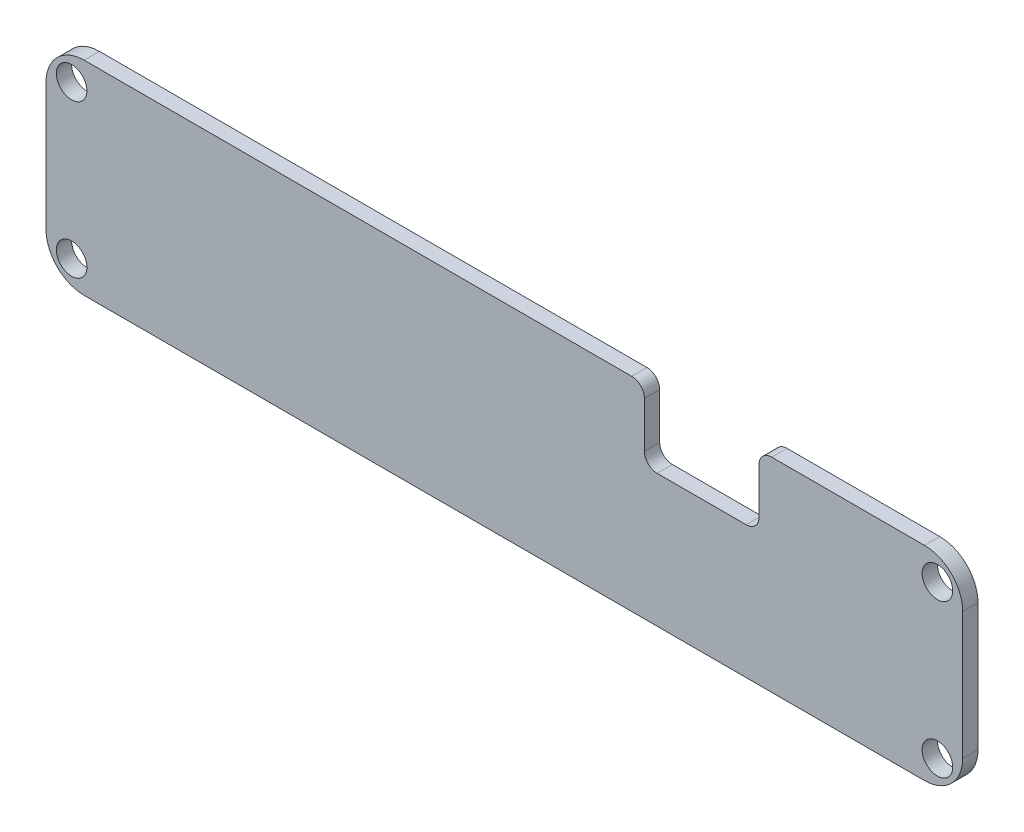
ISO-10303-21;
HEADER;
FILE_DESCRIPTION(('STEP AP214'),'2;1');
FILE_NAME('part.step','',(''),(''),'','','');
FILE_SCHEMA(('AUTOMOTIVE_DESIGN { 1 0 10303 214 1 1 1 1 }'));
ENDSEC;
DATA;
#1=APPLICATION_CONTEXT('core data for automotive mechanical design processes');
#2=APPLICATION_PROTOCOL_DEFINITION('international standard','automotive_design',2000,#1);
#3=PRODUCT_CONTEXT('',#1,'mechanical');
#4=PRODUCT('Part','Part','',(#3));
#5=PRODUCT_RELATED_PRODUCT_CATEGORY('part','',(#4));
#6=PRODUCT_DEFINITION_FORMATION('','',#4);
#7=PRODUCT_DEFINITION_CONTEXT('part definition',#1,'design');
#8=PRODUCT_DEFINITION('design','',#6,#7);
#9=PRODUCT_DEFINITION_SHAPE('','',#8);
#10=(LENGTH_UNIT() NAMED_UNIT(*) SI_UNIT(.MILLI.,.METRE.));
#11=(NAMED_UNIT(*) PLANE_ANGLE_UNIT() SI_UNIT($,.RADIAN.));
#12=(NAMED_UNIT(*) SI_UNIT($,.STERADIAN.) SOLID_ANGLE_UNIT());
#13=UNCERTAINTY_MEASURE_WITH_UNIT(LENGTH_MEASURE(1.E-05),#10,'distance_accuracy_value','');
#14=(GEOMETRIC_REPRESENTATION_CONTEXT(3) GLOBAL_UNCERTAINTY_ASSIGNED_CONTEXT((#13)) GLOBAL_UNIT_ASSIGNED_CONTEXT((#10,
#11,#12)) REPRESENTATION_CONTEXT('',''));
#15=CARTESIAN_POINT('',(0.,0.,0.));
#16=DIRECTION('',(0.,0.,1.));
#17=DIRECTION('',(1.,0.,0.));
#18=AXIS2_PLACEMENT_3D('',#15,#16,#17);
#19=CARTESIAN_POINT('',(0.,16.,1.2));
#20=DIRECTION('',(0.,-1.,0.));
#21=DIRECTION('',(0.,0.,-1.));
#22=AXIS2_PLACEMENT_3D('',#19,#20,#21);
#23=PLANE('',#22);
#24=DIRECTION('',(-1.,0.,0.));
#25=VECTOR('',#24,1.);
#26=CARTESIAN_POINT('',(0.,16.,0.));
#27=LINE('',#26,#25);
#28=CARTESIAN_POINT('',(69.,16.,0.));
#29=VERTEX_POINT('',#28);
#30=CARTESIAN_POINT('',(57.,16.,0.));
#31=VERTEX_POINT('',#30);
#32=EDGE_CURVE('E192',#29,#31,#27,.T.);
#33=ORIENTED_EDGE('',*,*,#32,.T.);
#34=DIRECTION('',(0.,0.,-1.));
#35=VECTOR('',#34,1.);
#36=CARTESIAN_POINT('',(57.,16.,1.2));
#37=LINE('',#36,#35);
#38=CARTESIAN_POINT('',(57.,16.,1.2));
#39=VERTEX_POINT('',#38);
#40=EDGE_CURVE('E247',#31,#39,#37,.F.);
#41=ORIENTED_EDGE('',*,*,#40,.T.);
#42=DIRECTION('',(-1.,0.,0.));
#43=VECTOR('',#42,1.);
#44=CARTESIAN_POINT('',(0.,16.,1.2));
#45=LINE('',#44,#43);
#46=CARTESIAN_POINT('',(69.,16.,1.2));
#47=VERTEX_POINT('',#46);
#48=EDGE_CURVE('E195',#47,#39,#45,.T.);
#49=ORIENTED_EDGE('',*,*,#48,.F.);
#50=DIRECTION('',(0.,0.,-1.));
#51=VECTOR('',#50,1.);
#52=CARTESIAN_POINT('',(69.,16.,1.2));
#53=LINE('',#52,#51);
#54=EDGE_CURVE('E212',#47,#29,#53,.T.);
#55=ORIENTED_EDGE('',*,*,#54,.T.);
#56=EDGE_LOOP('',(#33,#41,#49,#55));
#57=FACE_BOUND('',#56,.T.);
#58=ADVANCED_FACE('F41',(#57),#23,.F.);
#59=CARTESIAN_POINT('',(0.,0.,1.2));
#60=DIRECTION('',(1.,0.,0.));
#61=DIRECTION('',(0.,0.,-1.));
#62=AXIS2_PLACEMENT_3D('',#59,#60,#61);
#63=PLANE('',#62);
#64=DIRECTION('',(0.,-1.,0.));
#65=VECTOR('',#64,1.);
#66=CARTESIAN_POINT('',(0.,0.,0.));
#67=LINE('',#66,#65);
#68=CARTESIAN_POINT('',(0.,13.,0.));
#69=VERTEX_POINT('',#68);
#70=CARTESIAN_POINT('',(0.,3.,0.));
#71=VERTEX_POINT('',#70);
#72=EDGE_CURVE('E183',#69,#71,#67,.T.);
#73=ORIENTED_EDGE('',*,*,#72,.T.);
#74=DIRECTION('',(0.,0.,-1.));
#75=VECTOR('',#74,1.);
#76=CARTESIAN_POINT('',(0.,3.,1.2));
#77=LINE('',#76,#75);
#78=CARTESIAN_POINT('',(0.,3.,1.2));
#79=VERTEX_POINT('',#78);
#80=EDGE_CURVE('E160',#71,#79,#77,.F.);
#81=ORIENTED_EDGE('',*,*,#80,.T.);
#82=DIRECTION('',(0.,-1.,0.));
#83=VECTOR('',#82,1.);
#84=CARTESIAN_POINT('',(0.,0.,1.2));
#85=LINE('',#84,#83);
#86=CARTESIAN_POINT('',(0.,13.,1.2));
#87=VERTEX_POINT('',#86);
#88=EDGE_CURVE('E194',#87,#79,#85,.T.);
#89=ORIENTED_EDGE('',*,*,#88,.F.);
#90=DIRECTION('',(0.,0.,-1.));
#91=VECTOR('',#90,1.);
#92=CARTESIAN_POINT('',(0.,13.,1.2));
#93=LINE('',#92,#91);
#94=EDGE_CURVE('E164',#87,#69,#93,.T.);
#95=ORIENTED_EDGE('',*,*,#94,.T.);
#96=EDGE_LOOP('',(#73,#81,#89,#95));
#97=FACE_BOUND('',#96,.T.);
#98=ADVANCED_FACE('F326',(#97),#63,.F.);
#99=CARTESIAN_POINT('',(0.,0.,1.2));
#100=DIRECTION('',(0.,1.,0.));
#101=DIRECTION('',(0.,0.,1.));
#102=AXIS2_PLACEMENT_3D('',#99,#100,#101);
#103=PLANE('',#102);
#104=DIRECTION('',(1.,0.,0.));
#105=VECTOR('',#104,1.);
#106=CARTESIAN_POINT('',(0.,0.,1.2));
#107=LINE('',#106,#105);
#108=CARTESIAN_POINT('',(3.,0.,1.2));
#109=VERTEX_POINT('',#108);
#110=CARTESIAN_POINT('',(69.,0.,1.2));
#111=VERTEX_POINT('',#110);
#112=EDGE_CURVE('E174',#109,#111,#107,.T.);
#113=ORIENTED_EDGE('',*,*,#112,.F.);
#114=DIRECTION('',(0.,0.,-1.));
#115=VECTOR('',#114,1.);
#116=CARTESIAN_POINT('',(3.,0.,1.2));
#117=LINE('',#116,#115);
#118=CARTESIAN_POINT('',(3.,0.,0.));
#119=VERTEX_POINT('',#118);
#120=EDGE_CURVE('E159',#109,#119,#117,.T.);
#121=ORIENTED_EDGE('',*,*,#120,.T.);
#122=DIRECTION('',(1.,0.,0.));
#123=VECTOR('',#122,1.);
#124=CARTESIAN_POINT('',(0.,0.,0.));
#125=LINE('',#124,#123);
#126=CARTESIAN_POINT('',(69.,0.,0.));
#127=VERTEX_POINT('',#126);
#128=EDGE_CURVE('E171',#119,#127,#125,.T.);
#129=ORIENTED_EDGE('',*,*,#128,.T.);
#130=DIRECTION('',(0.,0.,-1.));
#131=VECTOR('',#130,1.);
#132=CARTESIAN_POINT('',(69.,0.,1.2));
#133=LINE('',#132,#131);
#134=EDGE_CURVE('E176',#127,#111,#133,.F.);
#135=ORIENTED_EDGE('',*,*,#134,.T.);
#136=EDGE_LOOP('',(#113,#121,#129,#135));
#137=FACE_BOUND('',#136,.T.);
#138=ADVANCED_FACE('F170',(#137),#103,.F.);
#139=CARTESIAN_POINT('',(72.,0.,1.2));
#140=DIRECTION('',(-1.,0.,0.));
#141=DIRECTION('',(0.,0.,1.));
#142=AXIS2_PLACEMENT_3D('',#139,#140,#141);
#143=PLANE('',#142);
#144=DIRECTION('',(0.,1.,0.));
#145=VECTOR('',#144,1.);
#146=CARTESIAN_POINT('',(72.,0.,1.2));
#147=LINE('',#146,#145);
#148=CARTESIAN_POINT('',(72.,3.,1.2));
#149=VERTEX_POINT('',#148);
#150=CARTESIAN_POINT('',(72.,13.,1.2));
#151=VERTEX_POINT('',#150);
#152=EDGE_CURVE('E312',#149,#151,#147,.T.);
#153=ORIENTED_EDGE('',*,*,#152,.F.);
#154=DIRECTION('',(0.,0.,-1.));
#155=VECTOR('',#154,1.);
#156=CARTESIAN_POINT('',(72.,3.,1.2));
#157=LINE('',#156,#155);
#158=CARTESIAN_POINT('',(72.,3.,0.));
#159=VERTEX_POINT('',#158);
#160=EDGE_CURVE('E220',#149,#159,#157,.T.);
#161=ORIENTED_EDGE('',*,*,#160,.T.);
#162=DIRECTION('',(0.,1.,0.));
#163=VECTOR('',#162,1.);
#164=CARTESIAN_POINT('',(72.,0.,0.));
#165=LINE('',#164,#163);
#166=CARTESIAN_POINT('',(72.,13.,0.));
#167=VERTEX_POINT('',#166);
#168=EDGE_CURVE('E182',#159,#167,#165,.T.);
#169=ORIENTED_EDGE('',*,*,#168,.T.);
#170=DIRECTION('',(0.,0.,-1.));
#171=VECTOR('',#170,1.);
#172=CARTESIAN_POINT('',(72.,13.,1.2));
#173=LINE('',#172,#171);
#174=EDGE_CURVE('E218',#167,#151,#173,.F.);
#175=ORIENTED_EDGE('',*,*,#174,.T.);
#176=EDGE_LOOP('',(#153,#161,#169,#175));
#177=FACE_BOUND('',#176,.T.);
#178=ADVANCED_FACE('F361',(#177),#143,.F.);
#179=CARTESIAN_POINT('',(46.,16.,1.2));
#180=VERTEX_POINT('',#179);
#181=CARTESIAN_POINT('',(3.,16.,1.2));
#182=VERTEX_POINT('',#181);
#183=EDGE_CURVE('E314',#180,#182,#45,.T.);
#184=ORIENTED_EDGE('',*,*,#183,.F.);
#185=DIRECTION('',(0.,0.,1.));
#186=VECTOR('',#185,1.);
#187=CARTESIAN_POINT('',(46.,16.,1.2));
#188=LINE('',#187,#186);
#189=CARTESIAN_POINT('',(46.,16.,0.));
#190=VERTEX_POINT('',#189);
#191=EDGE_CURVE('E64',#180,#190,#188,.F.);
#192=ORIENTED_EDGE('',*,*,#191,.T.);
#193=CARTESIAN_POINT('',(3.,16.,0.));
#194=VERTEX_POINT('',#193);
#195=EDGE_CURVE('E186',#190,#194,#27,.T.);
#196=ORIENTED_EDGE('',*,*,#195,.T.);
#197=DIRECTION('',(0.,0.,-1.));
#198=VECTOR('',#197,1.);
#199=CARTESIAN_POINT('',(3.,16.,1.2));
#200=LINE('',#199,#198);
#201=EDGE_CURVE('E215',#194,#182,#200,.F.);
#202=ORIENTED_EDGE('',*,*,#201,.T.);
#203=EDGE_LOOP('',(#184,#192,#196,#202));
#204=FACE_BOUND('',#203,.T.);
#205=ADVANCED_FACE('F321',(#204),#23,.F.);
#206=CARTESIAN_POINT('',(0.,0.,1.2));
#207=DIRECTION('',(0.,0.,-1.));
#208=DIRECTION('',(-1.,0.,0.));
#209=AXIS2_PLACEMENT_3D('',#206,#207,#208);
#210=PLANE('',#209);
#211=DIRECTION('',(0.,-1.,0.));
#212=VECTOR('',#211,1.);
#213=CARTESIAN_POINT('',(47.,16.4000000000001,1.2));
#214=LINE('',#213,#212);
#215=CARTESIAN_POINT('',(47.,15.,1.2));
#216=VERTEX_POINT('',#215);
#217=CARTESIAN_POINT('',(47.,11.4000000000001,1.2));
#218=VERTEX_POINT('',#217);
#219=EDGE_CURVE('E335',#216,#218,#214,.T.);
#220=ORIENTED_EDGE('',*,*,#219,.F.);
#221=CARTESIAN_POINT('',(46.,15.,1.2));
#222=DIRECTION('',(0.,0.,-1.));
#223=DIRECTION('',(-1.,0.,0.));
#224=AXIS2_PLACEMENT_3D('',#221,#222,#223);
#225=CIRCLE('',#224,1.);
#226=EDGE_CURVE('E241',#216,#180,#225,.F.);
#227=ORIENTED_EDGE('',*,*,#226,.T.);
#228=ORIENTED_EDGE('',*,*,#183,.T.);
#229=CARTESIAN_POINT('',(3.,13.,1.2));
#230=DIRECTION('',(0.,0.,-1.));
#231=DIRECTION('',(-1.,0.,0.));
#232=AXIS2_PLACEMENT_3D('',#229,#230,#231);
#233=CIRCLE('',#232,3.);
#234=EDGE_CURVE('E208',#182,#87,#233,.F.);
#235=ORIENTED_EDGE('',*,*,#234,.T.);
#236=ORIENTED_EDGE('',*,*,#88,.T.);
#237=CARTESIAN_POINT('',(3.,3.,1.2));
#238=DIRECTION('',(0.,0.,-1.));
#239=DIRECTION('',(-1.,0.,0.));
#240=AXIS2_PLACEMENT_3D('',#237,#238,#239);
#241=CIRCLE('',#240,3.);
#242=EDGE_CURVE('E210',#79,#109,#241,.F.);
#243=ORIENTED_EDGE('',*,*,#242,.T.);
#244=ORIENTED_EDGE('',*,*,#112,.T.);
#245=CARTESIAN_POINT('',(69.,3.,1.2));
#246=DIRECTION('',(0.,0.,-1.));
#247=DIRECTION('',(-1.,0.,0.));
#248=AXIS2_PLACEMENT_3D('',#245,#246,#247);
#249=CIRCLE('',#248,3.);
#250=EDGE_CURVE('E206',#111,#149,#249,.F.);
#251=ORIENTED_EDGE('',*,*,#250,.T.);
#252=ORIENTED_EDGE('',*,*,#152,.T.);
#253=CARTESIAN_POINT('',(69.,13.,1.2));
#254=DIRECTION('',(0.,0.,-1.));
#255=DIRECTION('',(-1.,0.,0.));
#256=AXIS2_PLACEMENT_3D('',#253,#254,#255);
#257=CIRCLE('',#256,3.);
#258=EDGE_CURVE('E204',#151,#47,#257,.F.);
#259=ORIENTED_EDGE('',*,*,#258,.T.);
#260=ORIENTED_EDGE('',*,*,#48,.T.);
#261=CARTESIAN_POINT('',(57.,15.,1.2));
#262=DIRECTION('',(0.,0.,-1.));
#263=DIRECTION('',(-1.,0.,0.));
#264=AXIS2_PLACEMENT_3D('',#261,#262,#263);
#265=CIRCLE('',#264,1.);
#266=CARTESIAN_POINT('',(56.,15.,1.2));
#267=VERTEX_POINT('',#266);
#268=EDGE_CURVE('E239',#39,#267,#265,.F.);
#269=ORIENTED_EDGE('',*,*,#268,.T.);
#270=DIRECTION('',(0.,1.,0.));
#271=VECTOR('',#270,1.);
#272=CARTESIAN_POINT('',(56.,16.4000000000001,1.2));
#273=LINE('',#272,#271);
#274=CARTESIAN_POINT('',(56.,11.4000000000001,1.2));
#275=VERTEX_POINT('',#274);
#276=EDGE_CURVE('E265',#275,#267,#273,.T.);
#277=ORIENTED_EDGE('',*,*,#276,.F.);
#278=CARTESIAN_POINT('',(55.,11.4000000000001,1.2));
#279=DIRECTION('',(0.,0.,-1.));
#280=DIRECTION('',(-1.,0.,0.));
#281=AXIS2_PLACEMENT_3D('',#278,#279,#280);
#282=CIRCLE('',#281,1.);
#283=CARTESIAN_POINT('',(55.,10.4000000000001,1.2));
#284=VERTEX_POINT('',#283);
#285=EDGE_CURVE('E11',#275,#284,#282,.T.);
#286=ORIENTED_EDGE('',*,*,#285,.T.);
#287=DIRECTION('',(1.,0.,0.));
#288=VECTOR('',#287,1.);
#289=CARTESIAN_POINT('',(56.,10.4000000000001,1.2));
#290=LINE('',#289,#288);
#291=CARTESIAN_POINT('',(48.,10.4000000000001,1.2));
#292=VERTEX_POINT('',#291);
#293=EDGE_CURVE('E275',#292,#284,#290,.T.);
#294=ORIENTED_EDGE('',*,*,#293,.F.);
#295=CARTESIAN_POINT('',(48.,11.4000000000001,1.2));
#296=DIRECTION('',(0.,0.,-1.));
#297=DIRECTION('',(-1.,0.,0.));
#298=AXIS2_PLACEMENT_3D('',#295,#296,#297);
#299=CIRCLE('',#298,1.);
#300=EDGE_CURVE('E251',#292,#218,#299,.T.);
#301=ORIENTED_EDGE('',*,*,#300,.T.);
#302=EDGE_LOOP('',(#220,#227,#228,#235,#236,#243,#244,#251,#252,#259,#260,#269,#277,#286,#294,#301));
#303=FACE_BOUND('',#302,.T.);
#304=CARTESIAN_POINT('',(70.01269494539,2.012672085344,1.2));
#305=DIRECTION('',(0.,0.,-1.));
#306=DIRECTION('',(-1.,0.,0.));
#307=AXIS2_PLACEMENT_3D('',#304,#305,#306);
#308=CIRCLE('',#307,1.2);
#309=CARTESIAN_POINT('',(68.81269494539,2.012672085344,1.2));
#310=VERTEX_POINT('',#309);
#311=EDGE_CURVE('E293',#310,#310,#308,.F.);
#312=ORIENTED_EDGE('',*,*,#311,.F.);
#313=EDGE_LOOP('',(#312));
#314=FACE_BOUND('',#313,.T.);
#315=CARTESIAN_POINT('',(2.01194998815146,14.012003328258,1.2));
#316=DIRECTION('',(0.,0.,-1.));
#317=DIRECTION('',(-1.,0.,0.));
#318=AXIS2_PLACEMENT_3D('',#315,#316,#317);
#319=CIRCLE('',#318,1.2);
#320=CARTESIAN_POINT('',(0.811949988151463,14.012003328258,1.2));
#321=VERTEX_POINT('',#320);
#322=EDGE_CURVE('E292',#321,#321,#319,.F.);
#323=ORIENTED_EDGE('',*,*,#322,.F.);
#324=EDGE_LOOP('',(#323));
#325=FACE_BOUND('',#324,.T.);
#326=CARTESIAN_POINT('',(2.01250190500404,2.01300990602,1.2));
#327=DIRECTION('',(0.,0.,-1.));
#328=DIRECTION('',(-1.,0.,0.));
#329=AXIS2_PLACEMENT_3D('',#326,#327,#328);
#330=CIRCLE('',#329,1.2);
#331=CARTESIAN_POINT('',(0.812501905004044,2.01300990602,1.2));
#332=VERTEX_POINT('',#331);
#333=EDGE_CURVE('E280',#332,#332,#330,.F.);
#334=ORIENTED_EDGE('',*,*,#333,.F.);
#335=EDGE_LOOP('',(#334));
#336=FACE_BOUND('',#335,.T.);
#337=CARTESIAN_POINT('',(70.012877825756,14.013032766066,1.2));
#338=DIRECTION('',(0.,0.,-1.));
#339=DIRECTION('',(-1.,0.,0.));
#340=AXIS2_PLACEMENT_3D('',#337,#338,#339);
#341=CIRCLE('',#340,1.2);
#342=CARTESIAN_POINT('',(68.812877825756,14.013032766066,1.2));
#343=VERTEX_POINT('',#342);
#344=EDGE_CURVE('E188',#343,#343,#341,.F.);
#345=ORIENTED_EDGE('',*,*,#344,.F.);
#346=EDGE_LOOP('',(#345));
#347=FACE_BOUND('',#346,.T.);
#348=ADVANCED_FACE('F273',(#303,#314,#325,#336,#347),#210,.F.);
#349=CARTESIAN_POINT('',(0.,0.,0.));
#350=DIRECTION('',(0.,0.,-1.));
#351=DIRECTION('',(-1.,0.,0.));
#352=AXIS2_PLACEMENT_3D('',#349,#350,#351);
#353=PLANE('',#352);
#354=ORIENTED_EDGE('',*,*,#195,.F.);
#355=CARTESIAN_POINT('',(46.,15.,0.));
#356=DIRECTION('',(0.,0.,-1.));
#357=DIRECTION('',(-1.,0.,0.));
#358=AXIS2_PLACEMENT_3D('',#355,#356,#357);
#359=CIRCLE('',#358,1.);
#360=CARTESIAN_POINT('',(47.,15.,0.));
#361=VERTEX_POINT('',#360);
#362=EDGE_CURVE('E245',#190,#361,#359,.T.);
#363=ORIENTED_EDGE('',*,*,#362,.T.);
#364=DIRECTION('',(0.,1.,0.));
#365=VECTOR('',#364,1.);
#366=CARTESIAN_POINT('',(47.,16.4000000000001,0.));
#367=LINE('',#366,#365);
#368=CARTESIAN_POINT('',(47.,11.4000000000001,0.));
#369=VERTEX_POINT('',#368);
#370=EDGE_CURVE('E281',#369,#361,#367,.T.);
#371=ORIENTED_EDGE('',*,*,#370,.F.);
#372=CARTESIAN_POINT('',(48.,11.4000000000001,0.));
#373=DIRECTION('',(0.,0.,-1.));
#374=DIRECTION('',(-1.,0.,0.));
#375=AXIS2_PLACEMENT_3D('',#372,#373,#374);
#376=CIRCLE('',#375,1.);
#377=CARTESIAN_POINT('',(48.,10.4000000000001,0.));
#378=VERTEX_POINT('',#377);
#379=EDGE_CURVE('E249',#369,#378,#376,.F.);
#380=ORIENTED_EDGE('',*,*,#379,.T.);
#381=DIRECTION('',(-1.,0.,0.));
#382=VECTOR('',#381,1.);
#383=CARTESIAN_POINT('',(56.,10.4000000000001,0.));
#384=LINE('',#383,#382);
#385=CARTESIAN_POINT('',(55.,10.4000000000001,0.));
#386=VERTEX_POINT('',#385);
#387=EDGE_CURVE('E256',#386,#378,#384,.T.);
#388=ORIENTED_EDGE('',*,*,#387,.F.);
#389=CARTESIAN_POINT('',(55.,11.4000000000001,0.));
#390=DIRECTION('',(0.,0.,-1.));
#391=DIRECTION('',(-1.,0.,0.));
#392=AXIS2_PLACEMENT_3D('',#389,#390,#391);
#393=CIRCLE('',#392,1.);
#394=CARTESIAN_POINT('',(56.,11.4000000000001,0.));
#395=VERTEX_POINT('',#394);
#396=EDGE_CURVE('E49',#386,#395,#393,.F.);
#397=ORIENTED_EDGE('',*,*,#396,.T.);
#398=DIRECTION('',(0.,-1.,0.));
#399=VECTOR('',#398,1.);
#400=CARTESIAN_POINT('',(56.,16.4000000000001,0.));
#401=LINE('',#400,#399);
#402=CARTESIAN_POINT('',(56.,15.,0.));
#403=VERTEX_POINT('',#402);
#404=EDGE_CURVE('E254',#403,#395,#401,.T.);
#405=ORIENTED_EDGE('',*,*,#404,.F.);
#406=CARTESIAN_POINT('',(57.,15.,0.));
#407=DIRECTION('',(0.,0.,-1.));
#408=DIRECTION('',(-1.,0.,0.));
#409=AXIS2_PLACEMENT_3D('',#406,#407,#408);
#410=CIRCLE('',#409,1.);
#411=EDGE_CURVE('E56',#403,#31,#410,.T.);
#412=ORIENTED_EDGE('',*,*,#411,.T.);
#413=ORIENTED_EDGE('',*,*,#32,.F.);
#414=CARTESIAN_POINT('',(69.,13.,0.));
#415=DIRECTION('',(0.,0.,-1.));
#416=DIRECTION('',(-1.,0.,0.));
#417=AXIS2_PLACEMENT_3D('',#414,#415,#416);
#418=CIRCLE('',#417,3.);
#419=EDGE_CURVE('E175',#29,#167,#418,.T.);
#420=ORIENTED_EDGE('',*,*,#419,.T.);
#421=ORIENTED_EDGE('',*,*,#168,.F.);
#422=CARTESIAN_POINT('',(69.,3.,0.));
#423=DIRECTION('',(0.,0.,-1.));
#424=DIRECTION('',(-1.,0.,0.));
#425=AXIS2_PLACEMENT_3D('',#422,#423,#424);
#426=CIRCLE('',#425,3.);
#427=EDGE_CURVE('E181',#159,#127,#426,.T.);
#428=ORIENTED_EDGE('',*,*,#427,.T.);
#429=ORIENTED_EDGE('',*,*,#128,.F.);
#430=CARTESIAN_POINT('',(3.,3.,0.));
#431=DIRECTION('',(0.,0.,-1.));
#432=DIRECTION('',(-1.,0.,0.));
#433=AXIS2_PLACEMENT_3D('',#430,#431,#432);
#434=CIRCLE('',#433,3.);
#435=EDGE_CURVE('E155',#119,#71,#434,.T.);
#436=ORIENTED_EDGE('',*,*,#435,.T.);
#437=ORIENTED_EDGE('',*,*,#72,.F.);
#438=CARTESIAN_POINT('',(3.,13.,0.));
#439=DIRECTION('',(0.,0.,-1.));
#440=DIRECTION('',(-1.,0.,0.));
#441=AXIS2_PLACEMENT_3D('',#438,#439,#440);
#442=CIRCLE('',#441,3.);
#443=EDGE_CURVE('E165',#69,#194,#442,.T.);
#444=ORIENTED_EDGE('',*,*,#443,.T.);
#445=EDGE_LOOP('',(#354,#363,#371,#380,#388,#397,#405,#412,#413,#420,#421,#428,#429,#436,#437,#444));
#446=FACE_BOUND('',#445,.T.);
#447=CARTESIAN_POINT('',(70.01269494539,2.012672085344,0.));
#448=DIRECTION('',(0.,0.,-1.));
#449=DIRECTION('',(-1.,0.,0.));
#450=AXIS2_PLACEMENT_3D('',#447,#448,#449);
#451=CIRCLE('',#450,1.2);
#452=CARTESIAN_POINT('',(68.81269494539,2.012672085344,0.));
#453=VERTEX_POINT('',#452);
#454=EDGE_CURVE('E296',#453,#453,#451,.T.);
#455=ORIENTED_EDGE('',*,*,#454,.F.);
#456=EDGE_LOOP('',(#455));
#457=FACE_BOUND('',#456,.T.);
#458=CARTESIAN_POINT('',(2.01194998815146,14.012003328258,0.));
#459=DIRECTION('',(0.,0.,-1.));
#460=DIRECTION('',(-1.,0.,0.));
#461=AXIS2_PLACEMENT_3D('',#458,#459,#460);
#462=CIRCLE('',#461,1.2);
#463=CARTESIAN_POINT('',(0.811949988151463,14.012003328258,0.));
#464=VERTEX_POINT('',#463);
#465=EDGE_CURVE('E297',#464,#464,#462,.T.);
#466=ORIENTED_EDGE('',*,*,#465,.F.);
#467=EDGE_LOOP('',(#466));
#468=FACE_BOUND('',#467,.T.);
#469=CARTESIAN_POINT('',(2.01250190500404,2.01300990602,0.));
#470=DIRECTION('',(0.,0.,-1.));
#471=DIRECTION('',(-1.,0.,0.));
#472=AXIS2_PLACEMENT_3D('',#469,#470,#471);
#473=CIRCLE('',#472,1.2);
#474=CARTESIAN_POINT('',(0.812501905004044,2.01300990602,0.));
#475=VERTEX_POINT('',#474);
#476=EDGE_CURVE('E284',#475,#475,#473,.T.);
#477=ORIENTED_EDGE('',*,*,#476,.F.);
#478=EDGE_LOOP('',(#477));
#479=FACE_BOUND('',#478,.T.);
#480=CARTESIAN_POINT('',(70.012877825756,14.013032766066,0.));
#481=DIRECTION('',(0.,0.,-1.));
#482=DIRECTION('',(-1.,0.,0.));
#483=AXIS2_PLACEMENT_3D('',#480,#481,#482);
#484=CIRCLE('',#483,1.2);
#485=CARTESIAN_POINT('',(68.812877825756,14.013032766066,0.));
#486=VERTEX_POINT('',#485);
#487=EDGE_CURVE('E300',#486,#486,#484,.T.);
#488=ORIENTED_EDGE('',*,*,#487,.F.);
#489=EDGE_LOOP('',(#488));
#490=FACE_BOUND('',#489,.T.);
#491=ADVANCED_FACE('F178',(#446,#457,#468,#479,#490),#353,.T.);
#492=CARTESIAN_POINT('',(3.,3.,1.2));
#493=DIRECTION('',(0.,0.,-1.));
#494=DIRECTION('',(-1.,0.,0.));
#495=AXIS2_PLACEMENT_3D('',#492,#493,#494);
#496=CYLINDRICAL_SURFACE('',#495,3.);
#497=ORIENTED_EDGE('',*,*,#242,.F.);
#498=ORIENTED_EDGE('',*,*,#80,.F.);
#499=ORIENTED_EDGE('',*,*,#435,.F.);
#500=ORIENTED_EDGE('',*,*,#120,.F.);
#501=EDGE_LOOP('',(#497,#498,#499,#500));
#502=FACE_BOUND('',#501,.T.);
#503=ADVANCED_FACE('F158',(#502),#496,.T.);
#504=CARTESIAN_POINT('',(3.,13.,1.2));
#505=DIRECTION('',(0.,0.,-1.));
#506=DIRECTION('',(-1.,0.,0.));
#507=AXIS2_PLACEMENT_3D('',#504,#505,#506);
#508=CYLINDRICAL_SURFACE('',#507,3.);
#509=ORIENTED_EDGE('',*,*,#234,.F.);
#510=ORIENTED_EDGE('',*,*,#201,.F.);
#511=ORIENTED_EDGE('',*,*,#443,.F.);
#512=ORIENTED_EDGE('',*,*,#94,.F.);
#513=EDGE_LOOP('',(#509,#510,#511,#512));
#514=FACE_BOUND('',#513,.T.);
#515=ADVANCED_FACE('F324',(#514),#508,.T.);
#516=CARTESIAN_POINT('',(69.,3.,1.2));
#517=DIRECTION('',(0.,0.,-1.));
#518=DIRECTION('',(-1.,0.,0.));
#519=AXIS2_PLACEMENT_3D('',#516,#517,#518);
#520=CYLINDRICAL_SURFACE('',#519,3.);
#521=ORIENTED_EDGE('',*,*,#250,.F.);
#522=ORIENTED_EDGE('',*,*,#134,.F.);
#523=ORIENTED_EDGE('',*,*,#427,.F.);
#524=ORIENTED_EDGE('',*,*,#160,.F.);
#525=EDGE_LOOP('',(#521,#522,#523,#524));
#526=FACE_BOUND('',#525,.T.);
#527=ADVANCED_FACE('F378',(#526),#520,.T.);
#528=CARTESIAN_POINT('',(69.,13.,1.2));
#529=DIRECTION('',(0.,0.,-1.));
#530=DIRECTION('',(-1.,0.,0.));
#531=AXIS2_PLACEMENT_3D('',#528,#529,#530);
#532=CYLINDRICAL_SURFACE('',#531,3.);
#533=ORIENTED_EDGE('',*,*,#258,.F.);
#534=ORIENTED_EDGE('',*,*,#174,.F.);
#535=ORIENTED_EDGE('',*,*,#419,.F.);
#536=ORIENTED_EDGE('',*,*,#54,.F.);
#537=EDGE_LOOP('',(#533,#534,#535,#536));
#538=FACE_BOUND('',#537,.T.);
#539=ADVANCED_FACE('F380',(#538),#532,.T.);
#540=CARTESIAN_POINT('',(70.012877825756,14.013032766066,1.201));
#541=DIRECTION('',(0.,0.,-1.));
#542=DIRECTION('',(-1.,0.,0.));
#543=AXIS2_PLACEMENT_3D('',#540,#541,#542);
#544=CYLINDRICAL_SURFACE('',#543,1.2);
#545=ORIENTED_EDGE('',*,*,#487,.T.);
#546=EDGE_LOOP('',(#545));
#547=FACE_BOUND('',#546,.T.);
#548=ORIENTED_EDGE('',*,*,#344,.T.);
#549=EDGE_LOOP('',(#548));
#550=FACE_BOUND('',#549,.T.);
#551=ADVANCED_FACE('F383',(#547,#550),#544,.F.);
#552=CARTESIAN_POINT('',(2.01250190500404,2.01300990602,1.201));
#553=DIRECTION('',(0.,0.,-1.));
#554=DIRECTION('',(-1.,0.,0.));
#555=AXIS2_PLACEMENT_3D('',#552,#553,#554);
#556=CYLINDRICAL_SURFACE('',#555,1.2);
#557=ORIENTED_EDGE('',*,*,#476,.T.);
#558=EDGE_LOOP('',(#557));
#559=FACE_BOUND('',#558,.T.);
#560=ORIENTED_EDGE('',*,*,#333,.T.);
#561=EDGE_LOOP('',(#560));
#562=FACE_BOUND('',#561,.T.);
#563=ADVANCED_FACE('F388',(#559,#562),#556,.F.);
#564=CARTESIAN_POINT('',(2.01194998815146,14.012003328258,1.201));
#565=DIRECTION('',(0.,0.,-1.));
#566=DIRECTION('',(-1.,0.,0.));
#567=AXIS2_PLACEMENT_3D('',#564,#565,#566);
#568=CYLINDRICAL_SURFACE('',#567,1.2);
#569=ORIENTED_EDGE('',*,*,#465,.T.);
#570=EDGE_LOOP('',(#569));
#571=FACE_BOUND('',#570,.T.);
#572=ORIENTED_EDGE('',*,*,#322,.T.);
#573=EDGE_LOOP('',(#572));
#574=FACE_BOUND('',#573,.T.);
#575=ADVANCED_FACE('F448',(#571,#574),#568,.F.);
#576=CARTESIAN_POINT('',(70.01269494539,2.012672085344,1.201));
#577=DIRECTION('',(0.,0.,-1.));
#578=DIRECTION('',(-1.,0.,0.));
#579=AXIS2_PLACEMENT_3D('',#576,#577,#578);
#580=CYLINDRICAL_SURFACE('',#579,1.2);
#581=ORIENTED_EDGE('',*,*,#454,.T.);
#582=EDGE_LOOP('',(#581));
#583=FACE_BOUND('',#582,.T.);
#584=ORIENTED_EDGE('',*,*,#311,.T.);
#585=EDGE_LOOP('',(#584));
#586=FACE_BOUND('',#585,.T.);
#587=ADVANCED_FACE('F435',(#583,#586),#580,.F.);
#588=CARTESIAN_POINT('',(56.,16.4000000000001,1.201));
#589=DIRECTION('',(1.,0.,0.));
#590=DIRECTION('',(0.,0.,-1.));
#591=AXIS2_PLACEMENT_3D('',#588,#589,#590);
#592=PLANE('',#591);
#593=ORIENTED_EDGE('',*,*,#404,.T.);
#594=DIRECTION('',(0.,0.,-1.));
#595=VECTOR('',#594,1.);
#596=CARTESIAN_POINT('',(56.,11.4000000000001,1.2));
#597=LINE('',#596,#595);
#598=EDGE_CURVE('E237',#395,#275,#597,.F.);
#599=ORIENTED_EDGE('',*,*,#598,.T.);
#600=ORIENTED_EDGE('',*,*,#276,.T.);
#601=DIRECTION('',(0.,0.,-1.));
#602=VECTOR('',#601,1.);
#603=CARTESIAN_POINT('',(56.,15.,1.201));
#604=LINE('',#603,#602);
#605=EDGE_CURVE('E234',#267,#403,#604,.T.);
#606=ORIENTED_EDGE('',*,*,#605,.T.);
#607=EDGE_LOOP('',(#593,#599,#600,#606));
#608=FACE_BOUND('',#607,.T.);
#609=ADVANCED_FACE('F261',(#608),#592,.F.);
#610=CARTESIAN_POINT('',(47.,16.4000000000001,1.201));
#611=DIRECTION('',(-1.,0.,0.));
#612=DIRECTION('',(0.,0.,1.));
#613=AXIS2_PLACEMENT_3D('',#610,#611,#612);
#614=PLANE('',#613);
#615=ORIENTED_EDGE('',*,*,#219,.T.);
#616=DIRECTION('',(0.,0.,-1.));
#617=VECTOR('',#616,1.);
#618=CARTESIAN_POINT('',(47.,11.4000000000001,0.));
#619=LINE('',#618,#617);
#620=EDGE_CURVE('E226',#218,#369,#619,.T.);
#621=ORIENTED_EDGE('',*,*,#620,.T.);
#622=ORIENTED_EDGE('',*,*,#370,.T.);
#623=DIRECTION('',(0.,0.,1.));
#624=VECTOR('',#623,1.);
#625=CARTESIAN_POINT('',(47.,15.,1.201));
#626=LINE('',#625,#624);
#627=EDGE_CURVE('E223',#361,#216,#626,.T.);
#628=ORIENTED_EDGE('',*,*,#627,.T.);
#629=EDGE_LOOP('',(#615,#621,#622,#628));
#630=FACE_BOUND('',#629,.T.);
#631=ADVANCED_FACE('F334',(#630),#614,.F.);
#632=CARTESIAN_POINT('',(56.,10.4000000000001,1.201));
#633=DIRECTION('',(0.,-1.,0.));
#634=DIRECTION('',(0.,0.,-1.));
#635=AXIS2_PLACEMENT_3D('',#632,#633,#634);
#636=PLANE('',#635);
#637=ORIENTED_EDGE('',*,*,#387,.T.);
#638=DIRECTION('',(0.,0.,-1.));
#639=VECTOR('',#638,1.);
#640=CARTESIAN_POINT('',(48.,10.4000000000001,1.2));
#641=LINE('',#640,#639);
#642=EDGE_CURVE('E232',#378,#292,#641,.F.);
#643=ORIENTED_EDGE('',*,*,#642,.T.);
#644=ORIENTED_EDGE('',*,*,#293,.T.);
#645=DIRECTION('',(0.,0.,-1.));
#646=VECTOR('',#645,1.);
#647=CARTESIAN_POINT('',(55.,10.4000000000001,0.));
#648=LINE('',#647,#646);
#649=EDGE_CURVE('E229',#284,#386,#648,.T.);
#650=ORIENTED_EDGE('',*,*,#649,.T.);
#651=EDGE_LOOP('',(#637,#643,#644,#650));
#652=FACE_BOUND('',#651,.T.);
#653=ADVANCED_FACE('F278',(#652),#636,.F.);
#654=CARTESIAN_POINT('',(48.,11.4000000000001,1.201));
#655=DIRECTION('',(0.,0.,1.));
#656=DIRECTION('',(1.,0.,0.));
#657=AXIS2_PLACEMENT_3D('',#654,#655,#656);
#658=CYLINDRICAL_SURFACE('',#657,1.);
#659=ORIENTED_EDGE('',*,*,#300,.F.);
#660=ORIENTED_EDGE('',*,*,#642,.F.);
#661=ORIENTED_EDGE('',*,*,#379,.F.);
#662=ORIENTED_EDGE('',*,*,#620,.F.);
#663=EDGE_LOOP('',(#659,#660,#661,#662));
#664=FACE_BOUND('',#663,.T.);
#665=ADVANCED_FACE('F340',(#664),#658,.F.);
#666=CARTESIAN_POINT('',(55.,11.4000000000001,1.201));
#667=DIRECTION('',(0.,0.,1.));
#668=DIRECTION('',(1.,0.,0.));
#669=AXIS2_PLACEMENT_3D('',#666,#667,#668);
#670=CYLINDRICAL_SURFACE('',#669,1.);
#671=ORIENTED_EDGE('',*,*,#285,.F.);
#672=ORIENTED_EDGE('',*,*,#598,.F.);
#673=ORIENTED_EDGE('',*,*,#396,.F.);
#674=ORIENTED_EDGE('',*,*,#649,.F.);
#675=EDGE_LOOP('',(#671,#672,#673,#674));
#676=FACE_BOUND('',#675,.T.);
#677=ADVANCED_FACE('F268',(#676),#670,.F.);
#678=CARTESIAN_POINT('',(46.,15.,1.201));
#679=DIRECTION('',(0.,0.,1.));
#680=DIRECTION('',(1.,0.,0.));
#681=AXIS2_PLACEMENT_3D('',#678,#679,#680);
#682=CYLINDRICAL_SURFACE('',#681,1.);
#683=ORIENTED_EDGE('',*,*,#362,.F.);
#684=ORIENTED_EDGE('',*,*,#191,.F.);
#685=ORIENTED_EDGE('',*,*,#226,.F.);
#686=ORIENTED_EDGE('',*,*,#627,.F.);
#687=EDGE_LOOP('',(#683,#684,#685,#686));
#688=FACE_BOUND('',#687,.T.);
#689=ADVANCED_FACE('F331',(#688),#682,.T.);
#690=CARTESIAN_POINT('',(57.,15.,1.201));
#691=DIRECTION('',(0.,0.,-1.));
#692=DIRECTION('',(-1.,0.,0.));
#693=AXIS2_PLACEMENT_3D('',#690,#691,#692);
#694=CYLINDRICAL_SURFACE('',#693,1.);
#695=ORIENTED_EDGE('',*,*,#268,.F.);
#696=ORIENTED_EDGE('',*,*,#40,.F.);
#697=ORIENTED_EDGE('',*,*,#411,.F.);
#698=ORIENTED_EDGE('',*,*,#605,.F.);
#699=EDGE_LOOP('',(#695,#696,#697,#698));
#700=FACE_BOUND('',#699,.T.);
#701=ADVANCED_FACE('F43',(#700),#694,.T.);
#702=CLOSED_SHELL('',(#58,#98,#138,#178,#205,#348,#491,#503,#515,#527,#539,#551,#563,#575,#587,
#609,#631,#653,#665,#677,#689,#701));
#703=MANIFOLD_SOLID_BREP('B2',#702);
#704=ADVANCED_BREP_SHAPE_REPRESENTATION('',(#18,#703),#14);
#705=SHAPE_DEFINITION_REPRESENTATION(#9,#704);
ENDSEC;
END-ISO-10303-21;
